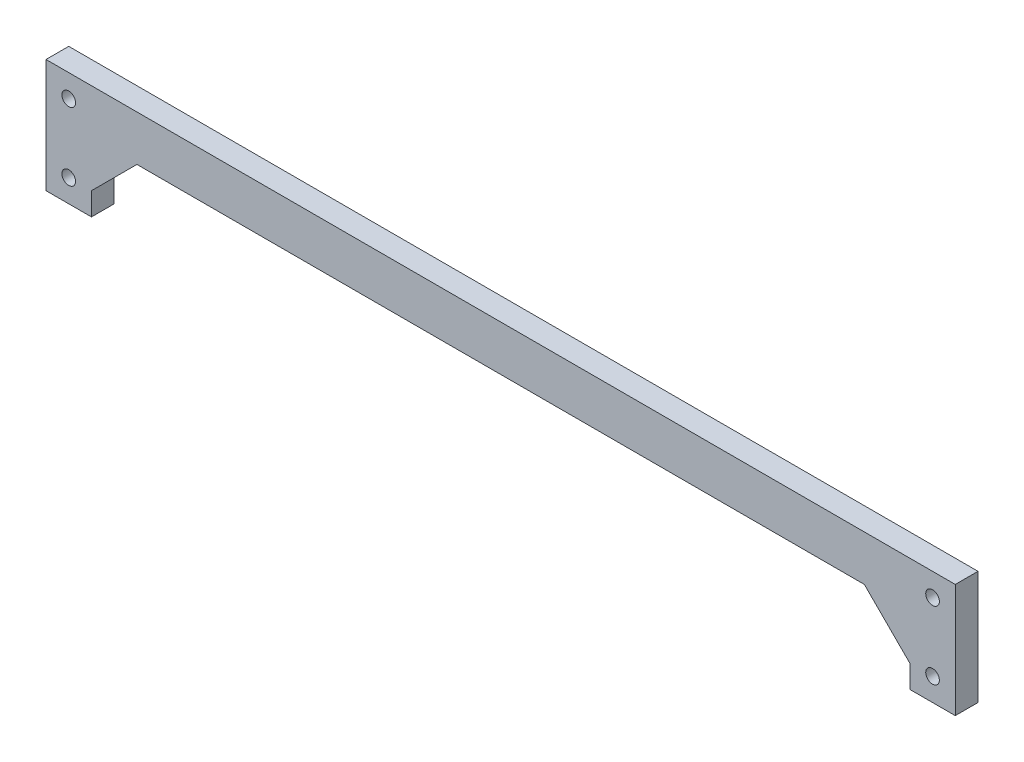
ISO-10303-21;
HEADER;
FILE_DESCRIPTION(('STEP AP214'),'2;1');
FILE_NAME('part.step','',(''),(''),'','','');
FILE_SCHEMA(('AUTOMOTIVE_DESIGN { 1 0 10303 214 1 1 1 1 }'));
ENDSEC;
DATA;
#1=APPLICATION_CONTEXT('core data for automotive mechanical design processes');
#2=APPLICATION_PROTOCOL_DEFINITION('international standard','automotive_design',2000,#1);
#3=PRODUCT_CONTEXT('',#1,'mechanical');
#4=PRODUCT('Part','Part','',(#3));
#5=PRODUCT_RELATED_PRODUCT_CATEGORY('part','',(#4));
#6=PRODUCT_DEFINITION_FORMATION('','',#4);
#7=PRODUCT_DEFINITION_CONTEXT('part definition',#1,'design');
#8=PRODUCT_DEFINITION('design','',#6,#7);
#9=PRODUCT_DEFINITION_SHAPE('','',#8);
#10=(LENGTH_UNIT() NAMED_UNIT(*) SI_UNIT(.MILLI.,.METRE.));
#11=(NAMED_UNIT(*) PLANE_ANGLE_UNIT() SI_UNIT($,.RADIAN.));
#12=(NAMED_UNIT(*) SI_UNIT($,.STERADIAN.) SOLID_ANGLE_UNIT());
#13=UNCERTAINTY_MEASURE_WITH_UNIT(LENGTH_MEASURE(1.E-05),#10,'distance_accuracy_value','');
#14=(GEOMETRIC_REPRESENTATION_CONTEXT(3) GLOBAL_UNCERTAINTY_ASSIGNED_CONTEXT((#13)) GLOBAL_UNIT_ASSIGNED_CONTEXT((#10,
#11,#12)) REPRESENTATION_CONTEXT('',''));
#15=CARTESIAN_POINT('',(0.,0.,0.));
#16=DIRECTION('',(0.,0.,1.));
#17=DIRECTION('',(1.,0.,0.));
#18=AXIS2_PLACEMENT_3D('',#15,#16,#17);
#19=CARTESIAN_POINT('',(0.,0.,5.));
#20=DIRECTION('',(0.,0.,1.));
#21=DIRECTION('',(1.,0.,0.));
#22=AXIS2_PLACEMENT_3D('',#19,#20,#21);
#23=PLANE('',#22);
#24=CARTESIAN_POINT('',(5.,-20.,5.));
#25=DIRECTION('',(0.,0.,1.));
#26=DIRECTION('',(1.,0.,0.));
#27=AXIS2_PLACEMENT_3D('',#24,#25,#26);
#28=CIRCLE('',#27,1.5);
#29=CARTESIAN_POINT('',(6.5,-20.,5.));
#30=VERTEX_POINT('',#29);
#31=EDGE_CURVE('E119',#30,#30,#28,.T.);
#32=ORIENTED_EDGE('',*,*,#31,.F.);
#33=EDGE_LOOP('',(#32));
#34=FACE_BOUND('',#33,.T.);
#35=DIRECTION('',(-1.,0.,0.));
#36=VECTOR('',#35,1.);
#37=CARTESIAN_POINT('',(100.,0.,5.));
#38=LINE('',#37,#36);
#39=CARTESIAN_POINT('',(200.,0.,5.));
#40=VERTEX_POINT('',#39);
#41=CARTESIAN_POINT('',(0.,0.,5.));
#42=VERTEX_POINT('',#41);
#43=EDGE_CURVE('E127',#40,#42,#38,.T.);
#44=ORIENTED_EDGE('',*,*,#43,.T.);
#45=DIRECTION('',(0.,-1.,0.));
#46=VECTOR('',#45,1.);
#47=CARTESIAN_POINT('',(0.,0.,5.));
#48=LINE('',#47,#46);
#49=CARTESIAN_POINT('',(0.,-25.,5.));
#50=VERTEX_POINT('',#49);
#51=EDGE_CURVE('E85',#42,#50,#48,.T.);
#52=ORIENTED_EDGE('',*,*,#51,.T.);
#53=DIRECTION('',(1.,0.,0.));
#54=VECTOR('',#53,1.);
#55=CARTESIAN_POINT('',(10.,-25.,5.));
#56=LINE('',#55,#54);
#57=CARTESIAN_POINT('',(10.,-25.,5.));
#58=VERTEX_POINT('',#57);
#59=EDGE_CURVE('E93',#50,#58,#56,.T.);
#60=ORIENTED_EDGE('',*,*,#59,.T.);
#61=DIRECTION('',(0.,1.,0.));
#62=VECTOR('',#61,1.);
#63=CARTESIAN_POINT('',(10.,-20.,5.));
#64=LINE('',#63,#62);
#65=CARTESIAN_POINT('',(10.,-20.,5.));
#66=VERTEX_POINT('',#65);
#67=EDGE_CURVE('E97',#58,#66,#64,.T.);
#68=ORIENTED_EDGE('',*,*,#67,.T.);
#69=DIRECTION('',(0.707106781186543,0.707106781186552,0.));
#70=VECTOR('',#69,1.);
#71=CARTESIAN_POINT('',(10.,-20.,5.));
#72=LINE('',#71,#70);
#73=CARTESIAN_POINT('',(19.9999999999999,-10.,5.));
#74=VERTEX_POINT('',#73);
#75=EDGE_CURVE('E50',#66,#74,#72,.T.);
#76=ORIENTED_EDGE('',*,*,#75,.T.);
#77=DIRECTION('',(1.,0.,0.));
#78=VECTOR('',#77,1.);
#79=CARTESIAN_POINT('',(19.9999999999999,-10.,5.));
#80=LINE('',#79,#78);
#81=CARTESIAN_POINT('',(180.,-10.,5.));
#82=VERTEX_POINT('',#81);
#83=EDGE_CURVE('E109',#74,#82,#80,.T.);
#84=ORIENTED_EDGE('',*,*,#83,.T.);
#85=DIRECTION('',(-0.707106781186543,0.707106781186552,0.));
#86=VECTOR('',#85,1.);
#87=CARTESIAN_POINT('',(190.,-20.,5.));
#88=LINE('',#87,#86);
#89=CARTESIAN_POINT('',(190.,-20.,5.));
#90=VERTEX_POINT('',#89);
#91=EDGE_CURVE('E151',#90,#82,#88,.T.);
#92=ORIENTED_EDGE('',*,*,#91,.F.);
#93=DIRECTION('',(0.,1.,0.));
#94=VECTOR('',#93,1.);
#95=CARTESIAN_POINT('',(190.,-20.,5.));
#96=LINE('',#95,#94);
#97=CARTESIAN_POINT('',(190.,-25.,5.));
#98=VERTEX_POINT('',#97);
#99=EDGE_CURVE('E157',#98,#90,#96,.T.);
#100=ORIENTED_EDGE('',*,*,#99,.F.);
#101=DIRECTION('',(-1.,0.,0.));
#102=VECTOR('',#101,1.);
#103=CARTESIAN_POINT('',(190.,-25.,5.));
#104=LINE('',#103,#102);
#105=CARTESIAN_POINT('',(200.,-25.,5.));
#106=VERTEX_POINT('',#105);
#107=EDGE_CURVE('E365',#106,#98,#104,.T.);
#108=ORIENTED_EDGE('',*,*,#107,.F.);
#109=DIRECTION('',(0.,-1.,0.));
#110=VECTOR('',#109,1.);
#111=CARTESIAN_POINT('',(200.,0.,5.));
#112=LINE('',#111,#110);
#113=EDGE_CURVE('E186',#40,#106,#112,.T.);
#114=ORIENTED_EDGE('',*,*,#113,.F.);
#115=EDGE_LOOP('',(#44,#52,#60,#68,#76,#84,#92,#100,#108,#114));
#116=FACE_BOUND('',#115,.T.);
#117=CARTESIAN_POINT('',(5.,-5.00000000000001,5.));
#118=DIRECTION('',(0.,0.,1.));
#119=DIRECTION('',(1.,0.,0.));
#120=AXIS2_PLACEMENT_3D('',#117,#118,#119);
#121=CIRCLE('',#120,1.5);
#122=CARTESIAN_POINT('',(6.5,-5.00000000000001,5.));
#123=VERTEX_POINT('',#122);
#124=EDGE_CURVE('E171',#123,#123,#121,.T.);
#125=ORIENTED_EDGE('',*,*,#124,.F.);
#126=EDGE_LOOP('',(#125));
#127=FACE_BOUND('',#126,.T.);
#128=CARTESIAN_POINT('',(195.,-20.,5.));
#129=DIRECTION('',(0.,0.,-1.));
#130=DIRECTION('',(-1.,0.,0.));
#131=AXIS2_PLACEMENT_3D('',#128,#129,#130);
#132=CIRCLE('',#131,1.5);
#133=CARTESIAN_POINT('',(193.5,-20.,5.));
#134=VERTEX_POINT('',#133);
#135=EDGE_CURVE('E358',#134,#134,#132,.T.);
#136=ORIENTED_EDGE('',*,*,#135,.T.);
#137=EDGE_LOOP('',(#136));
#138=FACE_BOUND('',#137,.T.);
#139=CARTESIAN_POINT('',(195.,-5.00000000000001,5.));
#140=DIRECTION('',(0.,0.,-1.));
#141=DIRECTION('',(-1.,0.,0.));
#142=AXIS2_PLACEMENT_3D('',#139,#140,#141);
#143=CIRCLE('',#142,1.5);
#144=CARTESIAN_POINT('',(193.5,-5.00000000000001,5.));
#145=VERTEX_POINT('',#144);
#146=EDGE_CURVE('E349',#145,#145,#143,.T.);
#147=ORIENTED_EDGE('',*,*,#146,.T.);
#148=EDGE_LOOP('',(#147));
#149=FACE_BOUND('',#148,.T.);
#150=ADVANCED_FACE('F33',(#34,#116,#127,#138,#149),#23,.T.);
#151=CARTESIAN_POINT('',(0.,0.,0.));
#152=DIRECTION('',(0.,0.,1.));
#153=DIRECTION('',(1.,0.,0.));
#154=AXIS2_PLACEMENT_3D('',#151,#152,#153);
#155=PLANE('',#154);
#156=CARTESIAN_POINT('',(5.,-20.,0.));
#157=DIRECTION('',(0.,0.,1.));
#158=DIRECTION('',(1.,0.,0.));
#159=AXIS2_PLACEMENT_3D('',#156,#157,#158);
#160=CIRCLE('',#159,1.5);
#161=CARTESIAN_POINT('',(6.5,-20.,0.));
#162=VERTEX_POINT('',#161);
#163=EDGE_CURVE('E174',#162,#162,#160,.T.);
#164=ORIENTED_EDGE('',*,*,#163,.T.);
#165=EDGE_LOOP('',(#164));
#166=FACE_BOUND('',#165,.T.);
#167=DIRECTION('',(-1.,0.,0.));
#168=VECTOR('',#167,1.);
#169=CARTESIAN_POINT('',(100.,0.,0.));
#170=LINE('',#169,#168);
#171=CARTESIAN_POINT('',(200.,0.,0.));
#172=VERTEX_POINT('',#171);
#173=CARTESIAN_POINT('',(0.,0.,0.));
#174=VERTEX_POINT('',#173);
#175=EDGE_CURVE('E115',#172,#174,#170,.T.);
#176=ORIENTED_EDGE('',*,*,#175,.F.);
#177=DIRECTION('',(0.,-1.,0.));
#178=VECTOR('',#177,1.);
#179=CARTESIAN_POINT('',(200.,0.,0.));
#180=LINE('',#179,#178);
#181=CARTESIAN_POINT('',(200.,-25.,0.));
#182=VERTEX_POINT('',#181);
#183=EDGE_CURVE('E361',#172,#182,#180,.T.);
#184=ORIENTED_EDGE('',*,*,#183,.T.);
#185=DIRECTION('',(-1.,0.,0.));
#186=VECTOR('',#185,1.);
#187=CARTESIAN_POINT('',(190.,-25.,0.));
#188=LINE('',#187,#186);
#189=CARTESIAN_POINT('',(190.,-25.,0.));
#190=VERTEX_POINT('',#189);
#191=EDGE_CURVE('E372',#182,#190,#188,.T.);
#192=ORIENTED_EDGE('',*,*,#191,.T.);
#193=DIRECTION('',(0.,1.,0.));
#194=VECTOR('',#193,1.);
#195=CARTESIAN_POINT('',(190.,-20.,0.));
#196=LINE('',#195,#194);
#197=CARTESIAN_POINT('',(190.,-20.,0.));
#198=VERTEX_POINT('',#197);
#199=EDGE_CURVE('E374',#190,#198,#196,.T.);
#200=ORIENTED_EDGE('',*,*,#199,.T.);
#201=DIRECTION('',(-0.707106781186543,0.707106781186552,0.));
#202=VECTOR('',#201,1.);
#203=CARTESIAN_POINT('',(190.,-20.,0.));
#204=LINE('',#203,#202);
#205=CARTESIAN_POINT('',(180.,-10.,0.));
#206=VERTEX_POINT('',#205);
#207=EDGE_CURVE('E137',#198,#206,#204,.T.);
#208=ORIENTED_EDGE('',*,*,#207,.T.);
#209=DIRECTION('',(1.,0.,0.));
#210=VECTOR('',#209,1.);
#211=CARTESIAN_POINT('',(19.9999999999999,-10.,0.));
#212=LINE('',#211,#210);
#213=CARTESIAN_POINT('',(19.9999999999999,-10.,0.));
#214=VERTEX_POINT('',#213);
#215=EDGE_CURVE('E124',#214,#206,#212,.T.);
#216=ORIENTED_EDGE('',*,*,#215,.F.);
#217=DIRECTION('',(0.707106781186543,0.707106781186552,0.));
#218=VECTOR('',#217,1.);
#219=CARTESIAN_POINT('',(10.,-20.,0.));
#220=LINE('',#219,#218);
#221=CARTESIAN_POINT('',(10.,-20.,0.));
#222=VERTEX_POINT('',#221);
#223=EDGE_CURVE('E77',#222,#214,#220,.T.);
#224=ORIENTED_EDGE('',*,*,#223,.F.);
#225=DIRECTION('',(0.,1.,0.));
#226=VECTOR('',#225,1.);
#227=CARTESIAN_POINT('',(10.,-20.,0.));
#228=LINE('',#227,#226);
#229=CARTESIAN_POINT('',(10.,-25.,0.));
#230=VERTEX_POINT('',#229);
#231=EDGE_CURVE('E71',#230,#222,#228,.T.);
#232=ORIENTED_EDGE('',*,*,#231,.F.);
#233=DIRECTION('',(1.,0.,0.));
#234=VECTOR('',#233,1.);
#235=CARTESIAN_POINT('',(10.,-25.,0.));
#236=LINE('',#235,#234);
#237=CARTESIAN_POINT('',(0.,-25.,0.));
#238=VERTEX_POINT('',#237);
#239=EDGE_CURVE('E104',#238,#230,#236,.T.);
#240=ORIENTED_EDGE('',*,*,#239,.F.);
#241=DIRECTION('',(0.,-1.,0.));
#242=VECTOR('',#241,1.);
#243=CARTESIAN_POINT('',(0.,0.,0.));
#244=LINE('',#243,#242);
#245=EDGE_CURVE('E118',#174,#238,#244,.T.);
#246=ORIENTED_EDGE('',*,*,#245,.F.);
#247=EDGE_LOOP('',(#176,#184,#192,#200,#208,#216,#224,#232,#240,#246));
#248=FACE_BOUND('',#247,.T.);
#249=CARTESIAN_POINT('',(5.,-5.00000000000001,0.));
#250=DIRECTION('',(0.,0.,1.));
#251=DIRECTION('',(1.,0.,0.));
#252=AXIS2_PLACEMENT_3D('',#249,#250,#251);
#253=CIRCLE('',#252,1.5);
#254=CARTESIAN_POINT('',(6.5,-5.00000000000001,0.));
#255=VERTEX_POINT('',#254);
#256=EDGE_CURVE('E170',#255,#255,#253,.T.);
#257=ORIENTED_EDGE('',*,*,#256,.T.);
#258=EDGE_LOOP('',(#257));
#259=FACE_BOUND('',#258,.T.);
#260=CARTESIAN_POINT('',(195.,-20.,0.));
#261=DIRECTION('',(0.,0.,-1.));
#262=DIRECTION('',(-1.,0.,0.));
#263=AXIS2_PLACEMENT_3D('',#260,#261,#262);
#264=CIRCLE('',#263,1.5);
#265=CARTESIAN_POINT('',(193.5,-20.,0.));
#266=VERTEX_POINT('',#265);
#267=EDGE_CURVE('E355',#266,#266,#264,.T.);
#268=ORIENTED_EDGE('',*,*,#267,.F.);
#269=EDGE_LOOP('',(#268));
#270=FACE_BOUND('',#269,.T.);
#271=CARTESIAN_POINT('',(195.,-5.00000000000001,0.));
#272=DIRECTION('',(0.,0.,-1.));
#273=DIRECTION('',(-1.,0.,0.));
#274=AXIS2_PLACEMENT_3D('',#271,#272,#273);
#275=CIRCLE('',#274,1.5);
#276=CARTESIAN_POINT('',(193.5,-5.00000000000001,0.));
#277=VERTEX_POINT('',#276);
#278=EDGE_CURVE('E352',#277,#277,#275,.T.);
#279=ORIENTED_EDGE('',*,*,#278,.F.);
#280=EDGE_LOOP('',(#279));
#281=FACE_BOUND('',#280,.T.);
#282=ADVANCED_FACE('F131',(#166,#248,#259,#270,#281),#155,.F.);
#283=CARTESIAN_POINT('',(100.,0.,5.));
#284=DIRECTION('',(0.,-1.,0.));
#285=DIRECTION('',(0.,0.,-1.));
#286=AXIS2_PLACEMENT_3D('',#283,#284,#285);
#287=PLANE('',#286);
#288=ORIENTED_EDGE('',*,*,#175,.T.);
#289=DIRECTION('',(0.,0.,-1.));
#290=VECTOR('',#289,1.);
#291=CARTESIAN_POINT('',(0.,0.,5.));
#292=LINE('',#291,#290);
#293=EDGE_CURVE('E11',#42,#174,#292,.T.);
#294=ORIENTED_EDGE('',*,*,#293,.F.);
#295=ORIENTED_EDGE('',*,*,#43,.F.);
#296=DIRECTION('',(0.,0.,-1.));
#297=VECTOR('',#296,1.);
#298=CARTESIAN_POINT('',(200.,0.,5.));
#299=LINE('',#298,#297);
#300=EDGE_CURVE('E167',#40,#172,#299,.T.);
#301=ORIENTED_EDGE('',*,*,#300,.T.);
#302=EDGE_LOOP('',(#288,#294,#295,#301));
#303=FACE_BOUND('',#302,.T.);
#304=ADVANCED_FACE('F35',(#303),#287,.F.);
#305=CARTESIAN_POINT('',(0.,0.,5.));
#306=DIRECTION('',(1.,0.,0.));
#307=DIRECTION('',(0.,0.,-1.));
#308=AXIS2_PLACEMENT_3D('',#305,#306,#307);
#309=PLANE('',#308);
#310=ORIENTED_EDGE('',*,*,#245,.T.);
#311=DIRECTION('',(0.,0.,-1.));
#312=VECTOR('',#311,1.);
#313=CARTESIAN_POINT('',(0.,-25.,5.));
#314=LINE('',#313,#312);
#315=EDGE_CURVE('E42',#50,#238,#314,.T.);
#316=ORIENTED_EDGE('',*,*,#315,.F.);
#317=ORIENTED_EDGE('',*,*,#51,.F.);
#318=ORIENTED_EDGE('',*,*,#293,.T.);
#319=EDGE_LOOP('',(#310,#316,#317,#318));
#320=FACE_BOUND('',#319,.T.);
#321=ADVANCED_FACE('F189',(#320),#309,.F.);
#322=CARTESIAN_POINT('',(10.,-25.,5.));
#323=DIRECTION('',(0.,1.,0.));
#324=DIRECTION('',(0.,0.,1.));
#325=AXIS2_PLACEMENT_3D('',#322,#323,#324);
#326=PLANE('',#325);
#327=ORIENTED_EDGE('',*,*,#239,.T.);
#328=DIRECTION('',(0.,0.,-1.));
#329=VECTOR('',#328,1.);
#330=CARTESIAN_POINT('',(10.,-25.,5.));
#331=LINE('',#330,#329);
#332=EDGE_CURVE('E101',#58,#230,#331,.T.);
#333=ORIENTED_EDGE('',*,*,#332,.F.);
#334=ORIENTED_EDGE('',*,*,#59,.F.);
#335=ORIENTED_EDGE('',*,*,#315,.T.);
#336=EDGE_LOOP('',(#327,#333,#334,#335));
#337=FACE_BOUND('',#336,.T.);
#338=ADVANCED_FACE('F102',(#337),#326,.F.);
#339=CARTESIAN_POINT('',(10.,-20.,5.));
#340=DIRECTION('',(-1.,0.,0.));
#341=DIRECTION('',(0.,-1.,0.));
#342=AXIS2_PLACEMENT_3D('',#339,#340,#341);
#343=PLANE('',#342);
#344=ORIENTED_EDGE('',*,*,#231,.T.);
#345=DIRECTION('',(0.,0.,-1.));
#346=VECTOR('',#345,1.);
#347=CARTESIAN_POINT('',(10.,-20.,5.));
#348=LINE('',#347,#346);
#349=EDGE_CURVE('E105',#66,#222,#348,.T.);
#350=ORIENTED_EDGE('',*,*,#349,.F.);
#351=ORIENTED_EDGE('',*,*,#67,.F.);
#352=ORIENTED_EDGE('',*,*,#332,.T.);
#353=EDGE_LOOP('',(#344,#350,#351,#352));
#354=FACE_BOUND('',#353,.T.);
#355=ADVANCED_FACE('F107',(#354),#343,.F.);
#356=CARTESIAN_POINT('',(10.,-20.,5.));
#357=DIRECTION('',(-0.707106781186552,0.707106781186543,0.));
#358=DIRECTION('',(-0.707106781186543,-0.707106781186552,0.));
#359=AXIS2_PLACEMENT_3D('',#356,#357,#358);
#360=PLANE('',#359);
#361=ORIENTED_EDGE('',*,*,#223,.T.);
#362=DIRECTION('',(0.,0.,-1.));
#363=VECTOR('',#362,1.);
#364=CARTESIAN_POINT('',(19.9999999999999,-10.,5.));
#365=LINE('',#364,#363);
#366=EDGE_CURVE('E114',#74,#214,#365,.T.);
#367=ORIENTED_EDGE('',*,*,#366,.F.);
#368=ORIENTED_EDGE('',*,*,#75,.F.);
#369=ORIENTED_EDGE('',*,*,#349,.T.);
#370=EDGE_LOOP('',(#361,#367,#368,#369));
#371=FACE_BOUND('',#370,.T.);
#372=ADVANCED_FACE('F211',(#371),#360,.F.);
#373=CARTESIAN_POINT('',(19.9999999999999,-10.,5.));
#374=DIRECTION('',(0.,1.,0.));
#375=DIRECTION('',(0.,0.,1.));
#376=AXIS2_PLACEMENT_3D('',#373,#374,#375);
#377=PLANE('',#376);
#378=ORIENTED_EDGE('',*,*,#215,.T.);
#379=DIRECTION('',(0.,0.,-1.));
#380=VECTOR('',#379,1.);
#381=CARTESIAN_POINT('',(180.,-10.,5.));
#382=LINE('',#381,#380);
#383=EDGE_CURVE('E143',#82,#206,#382,.T.);
#384=ORIENTED_EDGE('',*,*,#383,.F.);
#385=ORIENTED_EDGE('',*,*,#83,.F.);
#386=ORIENTED_EDGE('',*,*,#366,.T.);
#387=EDGE_LOOP('',(#378,#384,#385,#386));
#388=FACE_BOUND('',#387,.T.);
#389=ADVANCED_FACE('F141',(#388),#377,.F.);
#390=CARTESIAN_POINT('',(5.,-20.,5.));
#391=DIRECTION('',(0.,0.,-1.));
#392=DIRECTION('',(-1.,0.,0.));
#393=AXIS2_PLACEMENT_3D('',#390,#391,#392);
#394=CYLINDRICAL_SURFACE('',#393,1.5);
#395=ORIENTED_EDGE('',*,*,#31,.T.);
#396=EDGE_LOOP('',(#395));
#397=FACE_BOUND('',#396,.T.);
#398=ORIENTED_EDGE('',*,*,#163,.F.);
#399=EDGE_LOOP('',(#398));
#400=FACE_BOUND('',#399,.T.);
#401=ADVANCED_FACE('F206',(#397,#400),#394,.F.);
#402=CARTESIAN_POINT('',(5.,-5.00000000000001,5.));
#403=DIRECTION('',(0.,0.,-1.));
#404=DIRECTION('',(-1.,0.,0.));
#405=AXIS2_PLACEMENT_3D('',#402,#403,#404);
#406=CYLINDRICAL_SURFACE('',#405,1.5);
#407=ORIENTED_EDGE('',*,*,#124,.T.);
#408=EDGE_LOOP('',(#407));
#409=FACE_BOUND('',#408,.T.);
#410=ORIENTED_EDGE('',*,*,#256,.F.);
#411=EDGE_LOOP('',(#410));
#412=FACE_BOUND('',#411,.T.);
#413=ADVANCED_FACE('F238',(#409,#412),#406,.F.);
#414=CARTESIAN_POINT('',(200.,0.,5.));
#415=DIRECTION('',(-1.,0.,0.));
#416=DIRECTION('',(0.,0.,-1.));
#417=AXIS2_PLACEMENT_3D('',#414,#415,#416);
#418=PLANE('',#417);
#419=ORIENTED_EDGE('',*,*,#183,.F.);
#420=ORIENTED_EDGE('',*,*,#300,.F.);
#421=ORIENTED_EDGE('',*,*,#113,.T.);
#422=DIRECTION('',(0.,0.,-1.));
#423=VECTOR('',#422,1.);
#424=CARTESIAN_POINT('',(200.,-25.,5.));
#425=LINE('',#424,#423);
#426=EDGE_CURVE('E164',#106,#182,#425,.T.);
#427=ORIENTED_EDGE('',*,*,#426,.T.);
#428=EDGE_LOOP('',(#419,#420,#421,#427));
#429=FACE_BOUND('',#428,.T.);
#430=ADVANCED_FACE('F247',(#429),#418,.F.);
#431=CARTESIAN_POINT('',(190.,-25.,5.));
#432=DIRECTION('',(0.,1.,0.));
#433=DIRECTION('',(0.,0.,1.));
#434=AXIS2_PLACEMENT_3D('',#431,#432,#433);
#435=PLANE('',#434);
#436=ORIENTED_EDGE('',*,*,#191,.F.);
#437=ORIENTED_EDGE('',*,*,#426,.F.);
#438=ORIENTED_EDGE('',*,*,#107,.T.);
#439=DIRECTION('',(0.,0.,-1.));
#440=VECTOR('',#439,1.);
#441=CARTESIAN_POINT('',(190.,-25.,5.));
#442=LINE('',#441,#440);
#443=EDGE_CURVE('E155',#98,#190,#442,.T.);
#444=ORIENTED_EDGE('',*,*,#443,.T.);
#445=EDGE_LOOP('',(#436,#437,#438,#444));
#446=FACE_BOUND('',#445,.T.);
#447=ADVANCED_FACE('F255',(#446),#435,.F.);
#448=CARTESIAN_POINT('',(190.,-20.,5.));
#449=DIRECTION('',(1.,0.,0.));
#450=DIRECTION('',(0.,-1.,0.));
#451=AXIS2_PLACEMENT_3D('',#448,#449,#450);
#452=PLANE('',#451);
#453=ORIENTED_EDGE('',*,*,#199,.F.);
#454=ORIENTED_EDGE('',*,*,#443,.F.);
#455=ORIENTED_EDGE('',*,*,#99,.T.);
#456=DIRECTION('',(0.,0.,-1.));
#457=VECTOR('',#456,1.);
#458=CARTESIAN_POINT('',(190.,-20.,5.));
#459=LINE('',#458,#457);
#460=EDGE_CURVE('E152',#90,#198,#459,.T.);
#461=ORIENTED_EDGE('',*,*,#460,.T.);
#462=EDGE_LOOP('',(#453,#454,#455,#461));
#463=FACE_BOUND('',#462,.T.);
#464=ADVANCED_FACE('F263',(#463),#452,.F.);
#465=CARTESIAN_POINT('',(190.,-20.,5.));
#466=DIRECTION('',(0.707106781186552,0.707106781186543,0.));
#467=DIRECTION('',(0.707106781186543,-0.707106781186552,0.));
#468=AXIS2_PLACEMENT_3D('',#465,#466,#467);
#469=PLANE('',#468);
#470=ORIENTED_EDGE('',*,*,#207,.F.);
#471=ORIENTED_EDGE('',*,*,#460,.F.);
#472=ORIENTED_EDGE('',*,*,#91,.T.);
#473=ORIENTED_EDGE('',*,*,#383,.T.);
#474=EDGE_LOOP('',(#470,#471,#472,#473));
#475=FACE_BOUND('',#474,.T.);
#476=ADVANCED_FACE('F148',(#475),#469,.F.);
#477=CARTESIAN_POINT('',(195.,-20.,5.));
#478=DIRECTION('',(0.,0.,-1.));
#479=DIRECTION('',(1.,0.,0.));
#480=AXIS2_PLACEMENT_3D('',#477,#478,#479);
#481=CYLINDRICAL_SURFACE('',#480,1.5);
#482=ORIENTED_EDGE('',*,*,#135,.F.);
#483=EDGE_LOOP('',(#482));
#484=FACE_BOUND('',#483,.T.);
#485=ORIENTED_EDGE('',*,*,#267,.T.);
#486=EDGE_LOOP('',(#485));
#487=FACE_BOUND('',#486,.T.);
#488=ADVANCED_FACE('F278',(#484,#487),#481,.F.);
#489=CARTESIAN_POINT('',(195.,-5.00000000000001,5.));
#490=DIRECTION('',(0.,0.,-1.));
#491=DIRECTION('',(1.,0.,0.));
#492=AXIS2_PLACEMENT_3D('',#489,#490,#491);
#493=CYLINDRICAL_SURFACE('',#492,1.5);
#494=ORIENTED_EDGE('',*,*,#146,.F.);
#495=EDGE_LOOP('',(#494));
#496=FACE_BOUND('',#495,.T.);
#497=ORIENTED_EDGE('',*,*,#278,.T.);
#498=EDGE_LOOP('',(#497));
#499=FACE_BOUND('',#498,.T.);
#500=ADVANCED_FACE('F285',(#496,#499),#493,.F.);
#501=CLOSED_SHELL('',(#150,#282,#304,#321,#338,#355,#372,#389,#401,#413,#430,#447,#464,#476,
#488,#500));
#502=MANIFOLD_SOLID_BREP('B2',#501);
#503=ADVANCED_BREP_SHAPE_REPRESENTATION('',(#18,#502),#14);
#504=SHAPE_DEFINITION_REPRESENTATION(#9,#503);
ENDSEC;
END-ISO-10303-21;
